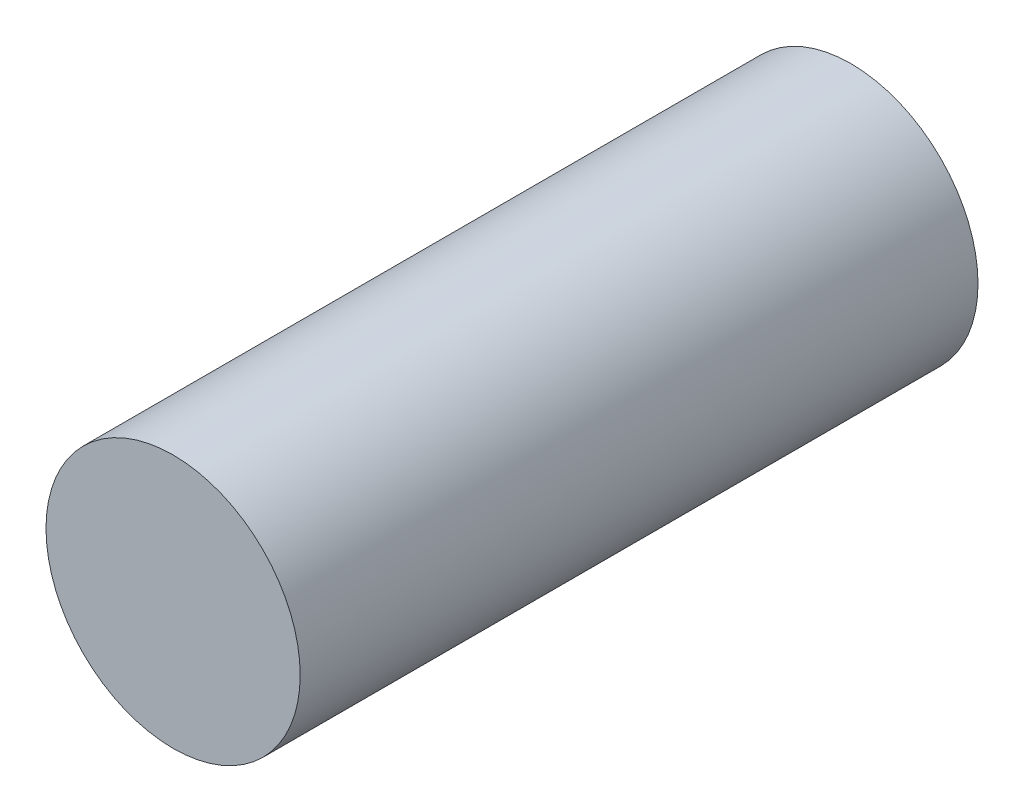
ISO-10303-21;
HEADER;
FILE_DESCRIPTION(('STEP AP214'),'2;1');
FILE_NAME('part.step','',(''),(''),'','','');
FILE_SCHEMA(('AUTOMOTIVE_DESIGN { 1 0 10303 214 1 1 1 1 }'));
ENDSEC;
DATA;
#1=APPLICATION_CONTEXT('core data for automotive mechanical design processes');
#2=APPLICATION_PROTOCOL_DEFINITION('international standard','automotive_design',2000,#1);
#3=PRODUCT_CONTEXT('',#1,'mechanical');
#4=PRODUCT('Part','Part','',(#3));
#5=PRODUCT_RELATED_PRODUCT_CATEGORY('part','',(#4));
#6=PRODUCT_DEFINITION_FORMATION('','',#4);
#7=PRODUCT_DEFINITION_CONTEXT('part definition',#1,'design');
#8=PRODUCT_DEFINITION('design','',#6,#7);
#9=PRODUCT_DEFINITION_SHAPE('','',#8);
#10=(LENGTH_UNIT() NAMED_UNIT(*) SI_UNIT(.MILLI.,.METRE.));
#11=(NAMED_UNIT(*) PLANE_ANGLE_UNIT() SI_UNIT($,.RADIAN.));
#12=(NAMED_UNIT(*) SI_UNIT($,.STERADIAN.) SOLID_ANGLE_UNIT());
#13=UNCERTAINTY_MEASURE_WITH_UNIT(LENGTH_MEASURE(1.E-05),#10,'distance_accuracy_value','');
#14=(GEOMETRIC_REPRESENTATION_CONTEXT(3) GLOBAL_UNCERTAINTY_ASSIGNED_CONTEXT((#13)) GLOBAL_UNIT_ASSIGNED_CONTEXT((#10,
#11,#12)) REPRESENTATION_CONTEXT('',''));
#15=CARTESIAN_POINT('',(0.,0.,0.));
#16=DIRECTION('',(0.,0.,1.));
#17=DIRECTION('',(1.,0.,0.));
#18=AXIS2_PLACEMENT_3D('',#15,#16,#17);
#19=CARTESIAN_POINT('',(0.,0.,406.4));
#20=DIRECTION('',(0.,0.,-1.));
#21=DIRECTION('',(-1.,0.,0.));
#22=AXIS2_PLACEMENT_3D('',#19,#20,#21);
#23=CYLINDRICAL_SURFACE('',#22,76.2);
#24=CARTESIAN_POINT('',(0.,0.,406.4));
#25=DIRECTION('',(0.,0.,1.));
#26=DIRECTION('',(1.,0.,0.));
#27=AXIS2_PLACEMENT_3D('',#24,#25,#26);
#28=CIRCLE('',#27,76.2);
#29=CARTESIAN_POINT('',(76.2,0.,406.4));
#30=VERTEX_POINT('',#29);
#31=EDGE_CURVE('E10',#30,#30,#28,.T.);
#32=ORIENTED_EDGE('',*,*,#31,.F.);
#33=EDGE_LOOP('',(#32));
#34=FACE_BOUND('',#33,.T.);
#35=CARTESIAN_POINT('',(0.,0.,0.));
#36=DIRECTION('',(0.,0.,1.));
#37=DIRECTION('',(1.,0.,0.));
#38=AXIS2_PLACEMENT_3D('',#35,#36,#37);
#39=CIRCLE('',#38,76.2);
#40=CARTESIAN_POINT('',(76.2,0.,0.));
#41=VERTEX_POINT('',#40);
#42=EDGE_CURVE('E40',#41,#41,#39,.T.);
#43=ORIENTED_EDGE('',*,*,#42,.T.);
#44=EDGE_LOOP('',(#43));
#45=FACE_BOUND('',#44,.T.);
#46=ADVANCED_FACE('F37',(#34,#45),#23,.T.);
#47=CARTESIAN_POINT('',(0.,0.,406.4));
#48=DIRECTION('',(0.,0.,1.));
#49=DIRECTION('',(1.,0.,0.));
#50=AXIS2_PLACEMENT_3D('',#47,#48,#49);
#51=PLANE('',#50);
#52=ORIENTED_EDGE('',*,*,#31,.T.);
#53=EDGE_LOOP('',(#52));
#54=FACE_BOUND('',#53,.T.);
#55=ADVANCED_FACE('F54',(#54),#51,.T.);
#56=CARTESIAN_POINT('',(0.,0.,0.));
#57=DIRECTION('',(0.,0.,1.));
#58=DIRECTION('',(1.,0.,0.));
#59=AXIS2_PLACEMENT_3D('',#56,#57,#58);
#60=PLANE('',#59);
#61=ORIENTED_EDGE('',*,*,#42,.F.);
#62=EDGE_LOOP('',(#61));
#63=FACE_BOUND('',#62,.T.);
#64=ADVANCED_FACE('F52',(#63),#60,.F.);
#65=CLOSED_SHELL('',(#46,#55,#64));
#66=MANIFOLD_SOLID_BREP('B2',#65);
#67=ADVANCED_BREP_SHAPE_REPRESENTATION('',(#18,#66),#14);
#68=SHAPE_DEFINITION_REPRESENTATION(#9,#67);
ENDSEC;
END-ISO-10303-21;
